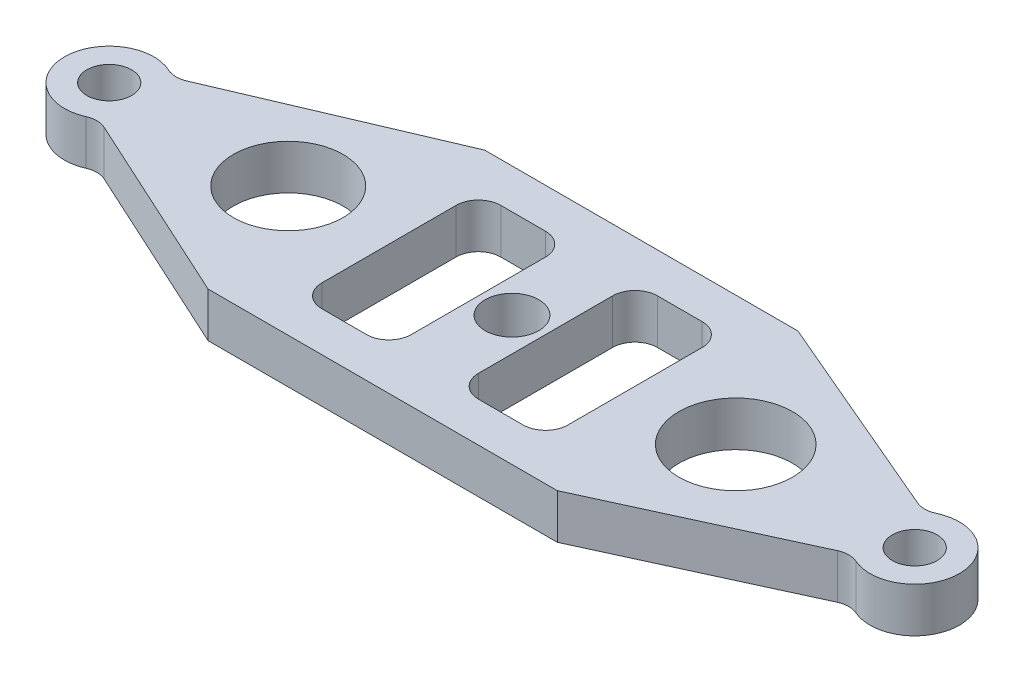
ISO-10303-21;
HEADER;
FILE_DESCRIPTION(('STEP AP214'),'2;1');
FILE_NAME('part.step','',(''),(''),'','','');
FILE_SCHEMA(('AUTOMOTIVE_DESIGN { 1 0 10303 214 1 1 1 1 }'));
ENDSEC;
DATA;
#1=APPLICATION_CONTEXT('core data for automotive mechanical design processes');
#2=APPLICATION_PROTOCOL_DEFINITION('international standard','automotive_design',2000,#1);
#3=PRODUCT_CONTEXT('',#1,'mechanical');
#4=PRODUCT('Part','Part','',(#3));
#5=PRODUCT_RELATED_PRODUCT_CATEGORY('part','',(#4));
#6=PRODUCT_DEFINITION_FORMATION('','',#4);
#7=PRODUCT_DEFINITION_CONTEXT('part definition',#1,'design');
#8=PRODUCT_DEFINITION('design','',#6,#7);
#9=PRODUCT_DEFINITION_SHAPE('','',#8);
#10=(LENGTH_UNIT() NAMED_UNIT(*) SI_UNIT(.MILLI.,.METRE.));
#11=(NAMED_UNIT(*) PLANE_ANGLE_UNIT() SI_UNIT($,.RADIAN.));
#12=(NAMED_UNIT(*) SI_UNIT($,.STERADIAN.) SOLID_ANGLE_UNIT());
#13=UNCERTAINTY_MEASURE_WITH_UNIT(LENGTH_MEASURE(1.E-05),#10,'distance_accuracy_value','');
#14=(GEOMETRIC_REPRESENTATION_CONTEXT(3) GLOBAL_UNCERTAINTY_ASSIGNED_CONTEXT((#13)) GLOBAL_UNIT_ASSIGNED_CONTEXT((#10,
#11,#12)) REPRESENTATION_CONTEXT('',''));
#15=CARTESIAN_POINT('',(0.,0.,0.));
#16=DIRECTION('',(0.,0.,1.));
#17=DIRECTION('',(1.,0.,0.));
#18=AXIS2_PLACEMENT_3D('',#15,#16,#17);
#19=CARTESIAN_POINT('',(83.6387655140134,10.,-13.5843548177414));
#20=DIRECTION('',(0.,-1.,0.));
#21=DIRECTION('',(0.,0.,-1.));
#22=AXIS2_PLACEMENT_3D('',#19,#20,#21);
#23=PLANE('',#22);
#24=CARTESIAN_POINT('',(12.5,10.,15.));
#25=DIRECTION('',(0.,1.,0.));
#26=DIRECTION('',(0.,0.,1.));
#27=AXIS2_PLACEMENT_3D('',#24,#25,#26);
#28=CIRCLE('',#27,5.);
#29=CARTESIAN_POINT('',(7.49999999999999,10.,15.));
#30=VERTEX_POINT('',#29);
#31=CARTESIAN_POINT('',(12.5,10.,20.));
#32=VERTEX_POINT('',#31);
#33=EDGE_CURVE('E286',#30,#32,#28,.T.);
#34=ORIENTED_EDGE('',*,*,#33,.F.);
#35=DIRECTION('',(0.,0.,1.));
#36=VECTOR('',#35,1.);
#37=CARTESIAN_POINT('',(7.49999999999998,10.,-15.));
#38=LINE('',#37,#36);
#39=CARTESIAN_POINT('',(7.49999999999998,10.,-15.));
#40=VERTEX_POINT('',#39);
#41=EDGE_CURVE('E302',#40,#30,#38,.T.);
#42=ORIENTED_EDGE('',*,*,#41,.F.);
#43=CARTESIAN_POINT('',(12.5,10.,-15.));
#44=DIRECTION('',(0.,1.,0.));
#45=DIRECTION('',(0.,0.,-1.));
#46=AXIS2_PLACEMENT_3D('',#43,#44,#45);
#47=CIRCLE('',#46,5.);
#48=CARTESIAN_POINT('',(12.5,10.,-20.));
#49=VERTEX_POINT('',#48);
#50=EDGE_CURVE('E299',#49,#40,#47,.T.);
#51=ORIENTED_EDGE('',*,*,#50,.F.);
#52=DIRECTION('',(-1.,0.,0.));
#53=VECTOR('',#52,1.);
#54=CARTESIAN_POINT('',(12.5,10.,-20.));
#55=LINE('',#54,#53);
#56=CARTESIAN_POINT('',(22.5,10.,-20.));
#57=VERTEX_POINT('',#56);
#58=EDGE_CURVE('E297',#57,#49,#55,.T.);
#59=ORIENTED_EDGE('',*,*,#58,.F.);
#60=CARTESIAN_POINT('',(22.5,10.,-15.));
#61=DIRECTION('',(0.,1.,0.));
#62=DIRECTION('',(0.,0.,1.));
#63=AXIS2_PLACEMENT_3D('',#60,#61,#62);
#64=CIRCLE('',#63,5.);
#65=CARTESIAN_POINT('',(27.5,10.,-15.));
#66=VERTEX_POINT('',#65);
#67=EDGE_CURVE('E295',#66,#57,#64,.T.);
#68=ORIENTED_EDGE('',*,*,#67,.F.);
#69=DIRECTION('',(0.,0.,-1.));
#70=VECTOR('',#69,1.);
#71=CARTESIAN_POINT('',(27.5,10.,-15.));
#72=LINE('',#71,#70);
#73=CARTESIAN_POINT('',(27.5,10.,15.));
#74=VERTEX_POINT('',#73);
#75=EDGE_CURVE('E293',#74,#66,#72,.T.);
#76=ORIENTED_EDGE('',*,*,#75,.F.);
#77=CARTESIAN_POINT('',(22.5,10.,15.));
#78=DIRECTION('',(0.,1.,0.));
#79=DIRECTION('',(0.,0.,1.));
#80=AXIS2_PLACEMENT_3D('',#77,#78,#79);
#81=CIRCLE('',#80,5.);
#82=CARTESIAN_POINT('',(22.5,10.,20.));
#83=VERTEX_POINT('',#82);
#84=EDGE_CURVE('E291',#83,#74,#81,.T.);
#85=ORIENTED_EDGE('',*,*,#84,.F.);
#86=DIRECTION('',(1.,0.,0.));
#87=VECTOR('',#86,1.);
#88=CARTESIAN_POINT('',(12.5,10.,20.));
#89=LINE('',#88,#87);
#90=EDGE_CURVE('E288',#32,#83,#89,.T.);
#91=ORIENTED_EDGE('',*,*,#90,.F.);
#92=EDGE_LOOP('',(#34,#42,#51,#59,#68,#76,#85,#91));
#93=FACE_BOUND('',#92,.T.);
#94=DIRECTION('',(-0.919841385932552,0.,-0.392290485132743));
#95=VECTOR('',#94,1.);
#96=CARTESIAN_POINT('',(35.,10.,-28.8919123326438));
#97=LINE('',#96,#95);
#98=CARTESIAN_POINT('',(81.6773130883497,10.,-8.98514788807868));
#99=VERTEX_POINT('',#98);
#100=CARTESIAN_POINT('',(35.,10.,-28.8919123326438));
#101=VERTEX_POINT('',#100);
#102=EDGE_CURVE('E375',#99,#101,#97,.T.);
#103=ORIENTED_EDGE('',*,*,#102,.T.);
#104=DIRECTION('',(-1.,0.,0.));
#105=VECTOR('',#104,1.);
#106=CARTESIAN_POINT('',(-35.,10.,-28.8919123326438));
#107=LINE('',#106,#105);
#108=CARTESIAN_POINT('',(-35.,10.,-28.8919123326438));
#109=VERTEX_POINT('',#108);
#110=EDGE_CURVE('E378',#101,#109,#107,.T.);
#111=ORIENTED_EDGE('',*,*,#110,.T.);
#112=DIRECTION('',(-0.919841385932552,0.,0.392290485132742));
#113=VECTOR('',#112,1.);
#114=CARTESIAN_POINT('',(-35.,10.,-28.8919123326438));
#115=LINE('',#114,#113);
#116=CARTESIAN_POINT('',(-81.6773130883497,10.,-8.98514788807866));
#117=VERTEX_POINT('',#116);
#118=EDGE_CURVE('E381',#109,#117,#115,.T.);
#119=ORIENTED_EDGE('',*,*,#118,.T.);
#120=CARTESIAN_POINT('',(-83.6387655140134,10.,-13.5843548177414));
#121=DIRECTION('',(0.,-1.,0.));
#122=DIRECTION('',(0.,0.,-1.));
#123=AXIS2_PLACEMENT_3D('',#120,#121,#122);
#124=CIRCLE('',#123,5.);
#125=CARTESIAN_POINT('',(-85.7591770093423,10.,-9.05623654516094));
#126=VERTEX_POINT('',#125);
#127=EDGE_CURVE('E383',#117,#126,#124,.T.);
#128=ORIENTED_EDGE('',*,*,#127,.T.);
#129=CARTESIAN_POINT('',(-90.,10.,0.));
#130=DIRECTION('',(0.,1.,0.));
#131=DIRECTION('',(0.,0.,1.));
#132=AXIS2_PLACEMENT_3D('',#129,#130,#131);
#133=CIRCLE('',#132,10.);
#134=CARTESIAN_POINT('',(-86.0054699959487,10.,9.16753674913463));
#135=VERTEX_POINT('',#134);
#136=EDGE_CURVE('E385',#126,#135,#133,.T.);
#137=ORIENTED_EDGE('',*,*,#136,.T.);
#138=CARTESIAN_POINT('',(-84.008204993923,10.,13.7513051237019));
#139=DIRECTION('',(0.,-1.,0.));
#140=DIRECTION('',(0.,0.,1.));
#141=AXIS2_PLACEMENT_3D('',#138,#139,#140);
#142=CIRCLE('',#141,5.);
#143=CARTESIAN_POINT('',(-81.9231757690581,10.,9.20678610278686));
#144=VERTEX_POINT('',#143);
#145=EDGE_CURVE('E387',#135,#144,#142,.T.);
#146=ORIENTED_EDGE('',*,*,#145,.T.);
#147=DIRECTION('',(0.908903804183016,0.,0.417005844972996));
#148=VECTOR('',#147,1.);
#149=CARTESIAN_POINT('',(-39.0175754475603,10.,28.8919123326438));
#150=LINE('',#149,#148);
#151=CARTESIAN_POINT('',(-39.0175754475603,10.,28.8919123326438));
#152=VERTEX_POINT('',#151);
#153=EDGE_CURVE('E389',#144,#152,#150,.T.);
#154=ORIENTED_EDGE('',*,*,#153,.T.);
#155=DIRECTION('',(1.,0.,0.));
#156=VECTOR('',#155,1.);
#157=CARTESIAN_POINT('',(-39.0175754475603,10.,28.8919123326438));
#158=LINE('',#157,#156);
#159=CARTESIAN_POINT('',(39.0175754475603,10.,28.8919123326438));
#160=VERTEX_POINT('',#159);
#161=EDGE_CURVE('E391',#152,#160,#158,.T.);
#162=ORIENTED_EDGE('',*,*,#161,.T.);
#163=DIRECTION('',(0.908903804183016,0.,-0.417005844972995));
#164=VECTOR('',#163,1.);
#165=CARTESIAN_POINT('',(39.0175754475603,10.,28.8919123326438));
#166=LINE('',#165,#164);
#167=CARTESIAN_POINT('',(81.9231757690581,10.,9.20678610278686));
#168=VERTEX_POINT('',#167);
#169=EDGE_CURVE('E393',#160,#168,#166,.T.);
#170=ORIENTED_EDGE('',*,*,#169,.T.);
#171=CARTESIAN_POINT('',(84.008204993923,10.,13.7513051237019));
#172=DIRECTION('',(0.,-1.,0.));
#173=DIRECTION('',(0.,0.,-1.));
#174=AXIS2_PLACEMENT_3D('',#171,#172,#173);
#175=CIRCLE('',#174,4.99999999999999);
#176=CARTESIAN_POINT('',(86.0054699959487,10.,9.16753674913463));
#177=VERTEX_POINT('',#176);
#178=EDGE_CURVE('E395',#168,#177,#175,.T.);
#179=ORIENTED_EDGE('',*,*,#178,.T.);
#180=CARTESIAN_POINT('',(90.,10.,0.));
#181=DIRECTION('',(0.,1.,0.));
#182=DIRECTION('',(0.,0.,1.));
#183=AXIS2_PLACEMENT_3D('',#180,#181,#182);
#184=CIRCLE('',#183,10.);
#185=CARTESIAN_POINT('',(85.7591770093423,10.,-9.05623654516096));
#186=VERTEX_POINT('',#185);
#187=EDGE_CURVE('E397',#177,#186,#184,.T.);
#188=ORIENTED_EDGE('',*,*,#187,.T.);
#189=CARTESIAN_POINT('',(83.6387655140134,10.,-13.5843548177414));
#190=DIRECTION('',(0.,-1.,0.));
#191=DIRECTION('',(0.,0.,-1.));
#192=AXIS2_PLACEMENT_3D('',#189,#190,#191);
#193=CIRCLE('',#192,5.);
#194=EDGE_CURVE('E399',#186,#99,#193,.T.);
#195=ORIENTED_EDGE('',*,*,#194,.T.);
#196=EDGE_LOOP('',(#103,#111,#119,#128,#137,#146,#154,#162,#170,#179,#188,#195));
#197=FACE_BOUND('',#196,.T.);
#198=CARTESIAN_POINT('',(50.,10.,0.));
#199=DIRECTION('',(0.,1.,0.));
#200=DIRECTION('',(0.,0.,1.));
#201=AXIS2_PLACEMENT_3D('',#198,#199,#200);
#202=CIRCLE('',#201,12.7);
#203=CARTESIAN_POINT('',(50.,10.,12.7));
#204=VERTEX_POINT('',#203);
#205=EDGE_CURVE('E369',#204,#204,#202,.T.);
#206=ORIENTED_EDGE('',*,*,#205,.F.);
#207=EDGE_LOOP('',(#206));
#208=FACE_BOUND('',#207,.T.);
#209=CARTESIAN_POINT('',(-50.,10.,0.));
#210=DIRECTION('',(0.,1.,0.));
#211=DIRECTION('',(0.,0.,1.));
#212=AXIS2_PLACEMENT_3D('',#209,#210,#211);
#213=CIRCLE('',#212,12.25);
#214=CARTESIAN_POINT('',(-50.,10.,12.25));
#215=VERTEX_POINT('',#214);
#216=EDGE_CURVE('E363',#215,#215,#213,.T.);
#217=ORIENTED_EDGE('',*,*,#216,.F.);
#218=EDGE_LOOP('',(#217));
#219=FACE_BOUND('',#218,.T.);
#220=CARTESIAN_POINT('',(-90.,10.,0.));
#221=DIRECTION('',(0.,1.,0.));
#222=DIRECTION('',(0.,0.,1.));
#223=AXIS2_PLACEMENT_3D('',#220,#221,#222);
#224=CIRCLE('',#223,5.);
#225=CARTESIAN_POINT('',(-90.,10.,5.00000000000001));
#226=VERTEX_POINT('',#225);
#227=EDGE_CURVE('E357',#226,#226,#224,.T.);
#228=ORIENTED_EDGE('',*,*,#227,.F.);
#229=EDGE_LOOP('',(#228));
#230=FACE_BOUND('',#229,.T.);
#231=CARTESIAN_POINT('',(90.,10.,0.));
#232=DIRECTION('',(0.,1.,0.));
#233=DIRECTION('',(0.,0.,1.));
#234=AXIS2_PLACEMENT_3D('',#231,#232,#233);
#235=CIRCLE('',#234,5.);
#236=CARTESIAN_POINT('',(90.,10.,5.));
#237=VERTEX_POINT('',#236);
#238=EDGE_CURVE('E351',#237,#237,#235,.T.);
#239=ORIENTED_EDGE('',*,*,#238,.F.);
#240=EDGE_LOOP('',(#239));
#241=FACE_BOUND('',#240,.T.);
#242=CARTESIAN_POINT('',(0.,10.,0.));
#243=DIRECTION('',(0.,1.,0.));
#244=DIRECTION('',(0.,0.,1.));
#245=AXIS2_PLACEMENT_3D('',#242,#243,#244);
#246=CIRCLE('',#245,6.);
#247=CARTESIAN_POINT('',(0.,10.,6.));
#248=VERTEX_POINT('',#247);
#249=EDGE_CURVE('E345',#248,#248,#246,.T.);
#250=ORIENTED_EDGE('',*,*,#249,.F.);
#251=EDGE_LOOP('',(#250));
#252=FACE_BOUND('',#251,.T.);
#253=CARTESIAN_POINT('',(-22.5,10.,15.));
#254=DIRECTION('',(0.,1.,0.));
#255=DIRECTION('',(0.,0.,1.));
#256=AXIS2_PLACEMENT_3D('',#253,#254,#255);
#257=CIRCLE('',#256,5.);
#258=CARTESIAN_POINT('',(-27.5,10.,15.));
#259=VERTEX_POINT('',#258);
#260=CARTESIAN_POINT('',(-22.5,10.,20.));
#261=VERTEX_POINT('',#260);
#262=EDGE_CURVE('E221',#259,#261,#257,.T.);
#263=ORIENTED_EDGE('',*,*,#262,.F.);
#264=DIRECTION('',(0.,0.,1.));
#265=VECTOR('',#264,1.);
#266=CARTESIAN_POINT('',(-27.5,10.,-15.));
#267=LINE('',#266,#265);
#268=CARTESIAN_POINT('',(-27.5,10.,-15.));
#269=VERTEX_POINT('',#268);
#270=EDGE_CURVE('E254',#269,#259,#267,.T.);
#271=ORIENTED_EDGE('',*,*,#270,.F.);
#272=CARTESIAN_POINT('',(-22.5,10.,-15.));
#273=DIRECTION('',(0.,1.,0.));
#274=DIRECTION('',(0.,0.,-1.));
#275=AXIS2_PLACEMENT_3D('',#272,#273,#274);
#276=CIRCLE('',#275,5.);
#277=CARTESIAN_POINT('',(-22.5,10.,-20.));
#278=VERTEX_POINT('',#277);
#279=EDGE_CURVE('E252',#278,#269,#276,.T.);
#280=ORIENTED_EDGE('',*,*,#279,.F.);
#281=DIRECTION('',(-1.,0.,0.));
#282=VECTOR('',#281,1.);
#283=CARTESIAN_POINT('',(-22.5,10.,-20.));
#284=LINE('',#283,#282);
#285=CARTESIAN_POINT('',(-12.5,10.,-20.));
#286=VERTEX_POINT('',#285);
#287=EDGE_CURVE('E250',#286,#278,#284,.T.);
#288=ORIENTED_EDGE('',*,*,#287,.F.);
#289=CARTESIAN_POINT('',(-12.5,10.,-15.));
#290=DIRECTION('',(0.,1.,0.));
#291=DIRECTION('',(0.,0.,1.));
#292=AXIS2_PLACEMENT_3D('',#289,#290,#291);
#293=CIRCLE('',#292,5.);
#294=CARTESIAN_POINT('',(-7.49999999999999,10.,-15.));
#295=VERTEX_POINT('',#294);
#296=EDGE_CURVE('E248',#295,#286,#293,.T.);
#297=ORIENTED_EDGE('',*,*,#296,.F.);
#298=DIRECTION('',(0.,0.,-1.));
#299=VECTOR('',#298,1.);
#300=CARTESIAN_POINT('',(-7.49999999999999,10.,-15.));
#301=LINE('',#300,#299);
#302=CARTESIAN_POINT('',(-7.49999999999998,10.,15.));
#303=VERTEX_POINT('',#302);
#304=EDGE_CURVE('E244',#303,#295,#301,.T.);
#305=ORIENTED_EDGE('',*,*,#304,.F.);
#306=CARTESIAN_POINT('',(-12.5,10.,15.));
#307=DIRECTION('',(0.,1.,0.));
#308=DIRECTION('',(0.,0.,1.));
#309=AXIS2_PLACEMENT_3D('',#306,#307,#308);
#310=CIRCLE('',#309,5.);
#311=CARTESIAN_POINT('',(-12.5,10.,20.));
#312=VERTEX_POINT('',#311);
#313=EDGE_CURVE('E242',#312,#303,#310,.T.);
#314=ORIENTED_EDGE('',*,*,#313,.F.);
#315=DIRECTION('',(1.,0.,0.));
#316=VECTOR('',#315,1.);
#317=CARTESIAN_POINT('',(-22.5,10.,20.));
#318=LINE('',#317,#316);
#319=EDGE_CURVE('E229',#261,#312,#318,.T.);
#320=ORIENTED_EDGE('',*,*,#319,.F.);
#321=EDGE_LOOP('',(#263,#271,#280,#288,#297,#305,#314,#320));
#322=FACE_BOUND('',#321,.T.);
#323=ADVANCED_FACE('F36',(#93,#197,#208,#219,#230,#241,#252,#322),#23,.F.);
#324=CARTESIAN_POINT('',(83.6387655140134,0.,-13.5843548177414));
#325=DIRECTION('',(0.,-1.,0.));
#326=DIRECTION('',(0.,0.,-1.));
#327=AXIS2_PLACEMENT_3D('',#324,#325,#326);
#328=PLANE('',#327);
#329=CARTESIAN_POINT('',(90.,0.,0.));
#330=DIRECTION('',(0.,1.,0.));
#331=DIRECTION('',(0.,0.,1.));
#332=AXIS2_PLACEMENT_3D('',#329,#330,#331);
#333=CIRCLE('',#332,5.);
#334=CARTESIAN_POINT('',(90.,0.,5.));
#335=VERTEX_POINT('',#334);
#336=EDGE_CURVE('E348',#335,#335,#333,.T.);
#337=ORIENTED_EDGE('',*,*,#336,.T.);
#338=EDGE_LOOP('',(#337));
#339=FACE_BOUND('',#338,.T.);
#340=CARTESIAN_POINT('',(-50.,0.,0.));
#341=DIRECTION('',(0.,1.,0.));
#342=DIRECTION('',(0.,0.,1.));
#343=AXIS2_PLACEMENT_3D('',#340,#341,#342);
#344=CIRCLE('',#343,12.25);
#345=CARTESIAN_POINT('',(-50.,0.,12.25));
#346=VERTEX_POINT('',#345);
#347=EDGE_CURVE('E360',#346,#346,#344,.T.);
#348=ORIENTED_EDGE('',*,*,#347,.T.);
#349=EDGE_LOOP('',(#348));
#350=FACE_BOUND('',#349,.T.);
#351=DIRECTION('',(-0.919841385932552,0.,-0.392290485132743));
#352=VECTOR('',#351,1.);
#353=CARTESIAN_POINT('',(35.,0.,-28.8919123326438));
#354=LINE('',#353,#352);
#355=CARTESIAN_POINT('',(81.6773130883497,0.,-8.98514788807868));
#356=VERTEX_POINT('',#355);
#357=CARTESIAN_POINT('',(35.,0.,-28.8919123326438));
#358=VERTEX_POINT('',#357);
#359=EDGE_CURVE('E372',#356,#358,#354,.T.);
#360=ORIENTED_EDGE('',*,*,#359,.F.);
#361=CARTESIAN_POINT('',(83.6387655140134,0.,-13.5843548177414));
#362=DIRECTION('',(0.,-1.,0.));
#363=DIRECTION('',(0.,0.,-1.));
#364=AXIS2_PLACEMENT_3D('',#361,#362,#363);
#365=CIRCLE('',#364,5.);
#366=CARTESIAN_POINT('',(85.7591770093423,0.,-9.05623654516096));
#367=VERTEX_POINT('',#366);
#368=EDGE_CURVE('E379',#367,#356,#365,.T.);
#369=ORIENTED_EDGE('',*,*,#368,.F.);
#370=CARTESIAN_POINT('',(90.,0.,0.));
#371=DIRECTION('',(0.,1.,0.));
#372=DIRECTION('',(0.,0.,1.));
#373=AXIS2_PLACEMENT_3D('',#370,#371,#372);
#374=CIRCLE('',#373,10.);
#375=CARTESIAN_POINT('',(86.0054699959487,0.,9.16753674913463));
#376=VERTEX_POINT('',#375);
#377=EDGE_CURVE('E422',#376,#367,#374,.T.);
#378=ORIENTED_EDGE('',*,*,#377,.F.);
#379=CARTESIAN_POINT('',(84.008204993923,0.,13.7513051237019));
#380=DIRECTION('',(0.,-1.,0.));
#381=DIRECTION('',(0.,0.,-1.));
#382=AXIS2_PLACEMENT_3D('',#379,#380,#381);
#383=CIRCLE('',#382,4.99999999999999);
#384=CARTESIAN_POINT('',(81.9231757690581,0.,9.20678610278686));
#385=VERTEX_POINT('',#384);
#386=EDGE_CURVE('E420',#385,#376,#383,.T.);
#387=ORIENTED_EDGE('',*,*,#386,.F.);
#388=DIRECTION('',(0.908903804183016,0.,-0.417005844972995));
#389=VECTOR('',#388,1.);
#390=CARTESIAN_POINT('',(39.0175754475603,0.,28.8919123326438));
#391=LINE('',#390,#389);
#392=CARTESIAN_POINT('',(39.0175754475603,0.,28.8919123326438));
#393=VERTEX_POINT('',#392);
#394=EDGE_CURVE('E418',#393,#385,#391,.T.);
#395=ORIENTED_EDGE('',*,*,#394,.F.);
#396=DIRECTION('',(1.,0.,0.));
#397=VECTOR('',#396,1.);
#398=CARTESIAN_POINT('',(-39.0175754475603,0.,28.8919123326438));
#399=LINE('',#398,#397);
#400=CARTESIAN_POINT('',(-39.0175754475603,0.,28.8919123326438));
#401=VERTEX_POINT('',#400);
#402=EDGE_CURVE('E416',#401,#393,#399,.T.);
#403=ORIENTED_EDGE('',*,*,#402,.F.);
#404=DIRECTION('',(0.908903804183016,0.,0.417005844972996));
#405=VECTOR('',#404,1.);
#406=CARTESIAN_POINT('',(-39.0175754475603,0.,28.8919123326438));
#407=LINE('',#406,#405);
#408=CARTESIAN_POINT('',(-81.9231757690581,0.,9.20678610278686));
#409=VERTEX_POINT('',#408);
#410=EDGE_CURVE('E414',#409,#401,#407,.T.);
#411=ORIENTED_EDGE('',*,*,#410,.F.);
#412=CARTESIAN_POINT('',(-84.008204993923,0.,13.7513051237019));
#413=DIRECTION('',(0.,-1.,0.));
#414=DIRECTION('',(0.,0.,1.));
#415=AXIS2_PLACEMENT_3D('',#412,#413,#414);
#416=CIRCLE('',#415,5.);
#417=CARTESIAN_POINT('',(-86.0054699959487,0.,9.16753674913463));
#418=VERTEX_POINT('',#417);
#419=EDGE_CURVE('E412',#418,#409,#416,.T.);
#420=ORIENTED_EDGE('',*,*,#419,.F.);
#421=CARTESIAN_POINT('',(-90.,0.,0.));
#422=DIRECTION('',(0.,1.,0.));
#423=DIRECTION('',(0.,0.,1.));
#424=AXIS2_PLACEMENT_3D('',#421,#422,#423);
#425=CIRCLE('',#424,10.);
#426=CARTESIAN_POINT('',(-85.7591770093423,0.,-9.05623654516094));
#427=VERTEX_POINT('',#426);
#428=EDGE_CURVE('E410',#427,#418,#425,.T.);
#429=ORIENTED_EDGE('',*,*,#428,.F.);
#430=CARTESIAN_POINT('',(-83.6387655140134,0.,-13.5843548177414));
#431=DIRECTION('',(0.,-1.,0.));
#432=DIRECTION('',(0.,0.,-1.));
#433=AXIS2_PLACEMENT_3D('',#430,#431,#432);
#434=CIRCLE('',#433,5.);
#435=CARTESIAN_POINT('',(-81.6773130883497,0.,-8.98514788807866));
#436=VERTEX_POINT('',#435);
#437=EDGE_CURVE('E408',#436,#427,#434,.T.);
#438=ORIENTED_EDGE('',*,*,#437,.F.);
#439=DIRECTION('',(-0.919841385932552,0.,0.392290485132742));
#440=VECTOR('',#439,1.);
#441=CARTESIAN_POINT('',(-35.,0.,-28.8919123326438));
#442=LINE('',#441,#440);
#443=CARTESIAN_POINT('',(-35.,0.,-28.8919123326438));
#444=VERTEX_POINT('',#443);
#445=EDGE_CURVE('E406',#444,#436,#442,.T.);
#446=ORIENTED_EDGE('',*,*,#445,.F.);
#447=DIRECTION('',(-1.,0.,0.));
#448=VECTOR('',#447,1.);
#449=CARTESIAN_POINT('',(-35.,0.,-28.8919123326438));
#450=LINE('',#449,#448);
#451=EDGE_CURVE('E404',#358,#444,#450,.T.);
#452=ORIENTED_EDGE('',*,*,#451,.F.);
#453=EDGE_LOOP('',(#360,#369,#378,#387,#395,#403,#411,#420,#429,#438,#446,#452));
#454=FACE_BOUND('',#453,.T.);
#455=CARTESIAN_POINT('',(50.,0.,0.));
#456=DIRECTION('',(0.,1.,0.));
#457=DIRECTION('',(0.,0.,1.));
#458=AXIS2_PLACEMENT_3D('',#455,#456,#457);
#459=CIRCLE('',#458,12.7);
#460=CARTESIAN_POINT('',(50.,0.,12.7));
#461=VERTEX_POINT('',#460);
#462=EDGE_CURVE('E366',#461,#461,#459,.T.);
#463=ORIENTED_EDGE('',*,*,#462,.T.);
#464=EDGE_LOOP('',(#463));
#465=FACE_BOUND('',#464,.T.);
#466=CARTESIAN_POINT('',(-90.,0.,0.));
#467=DIRECTION('',(0.,1.,0.));
#468=DIRECTION('',(0.,0.,1.));
#469=AXIS2_PLACEMENT_3D('',#466,#467,#468);
#470=CIRCLE('',#469,5.);
#471=CARTESIAN_POINT('',(-90.,0.,5.00000000000001));
#472=VERTEX_POINT('',#471);
#473=EDGE_CURVE('E354',#472,#472,#470,.T.);
#474=ORIENTED_EDGE('',*,*,#473,.T.);
#475=EDGE_LOOP('',(#474));
#476=FACE_BOUND('',#475,.T.);
#477=CARTESIAN_POINT('',(0.,0.,0.));
#478=DIRECTION('',(0.,1.,0.));
#479=DIRECTION('',(0.,0.,1.));
#480=AXIS2_PLACEMENT_3D('',#477,#478,#479);
#481=CIRCLE('',#480,6.);
#482=CARTESIAN_POINT('',(0.,0.,6.));
#483=VERTEX_POINT('',#482);
#484=EDGE_CURVE('E344',#483,#483,#481,.T.);
#485=ORIENTED_EDGE('',*,*,#484,.T.);
#486=EDGE_LOOP('',(#485));
#487=FACE_BOUND('',#486,.T.);
#488=DIRECTION('',(0.,0.,1.));
#489=VECTOR('',#488,1.);
#490=CARTESIAN_POINT('',(7.49999999999998,0.,-15.));
#491=LINE('',#490,#489);
#492=CARTESIAN_POINT('',(7.49999999999998,0.,-15.));
#493=VERTEX_POINT('',#492);
#494=CARTESIAN_POINT('',(7.49999999999999,0.,15.));
#495=VERTEX_POINT('',#494);
#496=EDGE_CURVE('E289',#493,#495,#491,.T.);
#497=ORIENTED_EDGE('',*,*,#496,.T.);
#498=CARTESIAN_POINT('',(12.5,0.,15.));
#499=DIRECTION('',(0.,1.,0.));
#500=DIRECTION('',(0.,0.,1.));
#501=AXIS2_PLACEMENT_3D('',#498,#499,#500);
#502=CIRCLE('',#501,5.);
#503=CARTESIAN_POINT('',(12.5,0.,20.));
#504=VERTEX_POINT('',#503);
#505=EDGE_CURVE('E237',#495,#504,#502,.T.);
#506=ORIENTED_EDGE('',*,*,#505,.T.);
#507=DIRECTION('',(1.,0.,0.));
#508=VECTOR('',#507,1.);
#509=CARTESIAN_POINT('',(12.5,0.,20.));
#510=LINE('',#509,#508);
#511=CARTESIAN_POINT('',(22.5,0.,20.));
#512=VERTEX_POINT('',#511);
#513=EDGE_CURVE('E307',#504,#512,#510,.T.);
#514=ORIENTED_EDGE('',*,*,#513,.T.);
#515=CARTESIAN_POINT('',(22.5,0.,15.));
#516=DIRECTION('',(0.,1.,0.));
#517=DIRECTION('',(0.,0.,1.));
#518=AXIS2_PLACEMENT_3D('',#515,#516,#517);
#519=CIRCLE('',#518,5.);
#520=CARTESIAN_POINT('',(27.5,0.,15.));
#521=VERTEX_POINT('',#520);
#522=EDGE_CURVE('E310',#512,#521,#519,.T.);
#523=ORIENTED_EDGE('',*,*,#522,.T.);
#524=DIRECTION('',(0.,0.,-1.));
#525=VECTOR('',#524,1.);
#526=CARTESIAN_POINT('',(27.5,0.,-15.));
#527=LINE('',#526,#525);
#528=CARTESIAN_POINT('',(27.5,0.,-15.));
#529=VERTEX_POINT('',#528);
#530=EDGE_CURVE('E313',#521,#529,#527,.T.);
#531=ORIENTED_EDGE('',*,*,#530,.T.);
#532=CARTESIAN_POINT('',(22.5,0.,-15.));
#533=DIRECTION('',(0.,1.,0.));
#534=DIRECTION('',(0.,0.,1.));
#535=AXIS2_PLACEMENT_3D('',#532,#533,#534);
#536=CIRCLE('',#535,5.);
#537=CARTESIAN_POINT('',(22.5,0.,-20.));
#538=VERTEX_POINT('',#537);
#539=EDGE_CURVE('E316',#529,#538,#536,.T.);
#540=ORIENTED_EDGE('',*,*,#539,.T.);
#541=DIRECTION('',(-1.,0.,0.));
#542=VECTOR('',#541,1.);
#543=CARTESIAN_POINT('',(12.5,0.,-20.));
#544=LINE('',#543,#542);
#545=CARTESIAN_POINT('',(12.5,0.,-20.));
#546=VERTEX_POINT('',#545);
#547=EDGE_CURVE('E319',#538,#546,#544,.T.);
#548=ORIENTED_EDGE('',*,*,#547,.T.);
#549=CARTESIAN_POINT('',(12.5,0.,-15.));
#550=DIRECTION('',(0.,1.,0.));
#551=DIRECTION('',(0.,0.,-1.));
#552=AXIS2_PLACEMENT_3D('',#549,#550,#551);
#553=CIRCLE('',#552,5.);
#554=EDGE_CURVE('E322',#546,#493,#553,.T.);
#555=ORIENTED_EDGE('',*,*,#554,.T.);
#556=EDGE_LOOP('',(#497,#506,#514,#523,#531,#540,#548,#555));
#557=FACE_BOUND('',#556,.T.);
#558=DIRECTION('',(0.,0.,1.));
#559=VECTOR('',#558,1.);
#560=CARTESIAN_POINT('',(-27.5,0.,-15.));
#561=LINE('',#560,#559);
#562=CARTESIAN_POINT('',(-27.5,0.,-15.));
#563=VERTEX_POINT('',#562);
#564=CARTESIAN_POINT('',(-27.5,0.,15.));
#565=VERTEX_POINT('',#564);
#566=EDGE_CURVE('E230',#563,#565,#561,.T.);
#567=ORIENTED_EDGE('',*,*,#566,.T.);
#568=CARTESIAN_POINT('',(-22.5,0.,15.));
#569=DIRECTION('',(0.,1.,0.));
#570=DIRECTION('',(0.,0.,1.));
#571=AXIS2_PLACEMENT_3D('',#568,#569,#570);
#572=CIRCLE('',#571,5.);
#573=CARTESIAN_POINT('',(-22.5,0.,20.));
#574=VERTEX_POINT('',#573);
#575=EDGE_CURVE('E59',#565,#574,#572,.T.);
#576=ORIENTED_EDGE('',*,*,#575,.T.);
#577=DIRECTION('',(1.,0.,0.));
#578=VECTOR('',#577,1.);
#579=CARTESIAN_POINT('',(-22.5,0.,20.));
#580=LINE('',#579,#578);
#581=CARTESIAN_POINT('',(-12.5,0.,20.));
#582=VERTEX_POINT('',#581);
#583=EDGE_CURVE('E236',#574,#582,#580,.T.);
#584=ORIENTED_EDGE('',*,*,#583,.T.);
#585=CARTESIAN_POINT('',(-12.5,0.,15.));
#586=DIRECTION('',(0.,1.,0.));
#587=DIRECTION('',(0.,0.,1.));
#588=AXIS2_PLACEMENT_3D('',#585,#586,#587);
#589=CIRCLE('',#588,5.);
#590=CARTESIAN_POINT('',(-7.49999999999998,0.,15.));
#591=VERTEX_POINT('',#590);
#592=EDGE_CURVE('E258',#582,#591,#589,.T.);
#593=ORIENTED_EDGE('',*,*,#592,.T.);
#594=DIRECTION('',(0.,0.,-1.));
#595=VECTOR('',#594,1.);
#596=CARTESIAN_POINT('',(-7.49999999999999,0.,-15.));
#597=LINE('',#596,#595);
#598=CARTESIAN_POINT('',(-7.49999999999999,0.,-15.));
#599=VERTEX_POINT('',#598);
#600=EDGE_CURVE('E261',#591,#599,#597,.T.);
#601=ORIENTED_EDGE('',*,*,#600,.T.);
#602=CARTESIAN_POINT('',(-12.5,0.,-15.));
#603=DIRECTION('',(0.,1.,0.));
#604=DIRECTION('',(0.,0.,1.));
#605=AXIS2_PLACEMENT_3D('',#602,#603,#604);
#606=CIRCLE('',#605,5.);
#607=CARTESIAN_POINT('',(-12.5,0.,-20.));
#608=VERTEX_POINT('',#607);
#609=EDGE_CURVE('E264',#599,#608,#606,.T.);
#610=ORIENTED_EDGE('',*,*,#609,.T.);
#611=DIRECTION('',(-1.,0.,0.));
#612=VECTOR('',#611,1.);
#613=CARTESIAN_POINT('',(-22.5,0.,-20.));
#614=LINE('',#613,#612);
#615=CARTESIAN_POINT('',(-22.5,0.,-20.));
#616=VERTEX_POINT('',#615);
#617=EDGE_CURVE('E267',#608,#616,#614,.T.);
#618=ORIENTED_EDGE('',*,*,#617,.T.);
#619=CARTESIAN_POINT('',(-22.5,0.,-15.));
#620=DIRECTION('',(0.,1.,0.));
#621=DIRECTION('',(0.,0.,-1.));
#622=AXIS2_PLACEMENT_3D('',#619,#620,#621);
#623=CIRCLE('',#622,5.);
#624=EDGE_CURVE('E270',#616,#563,#623,.T.);
#625=ORIENTED_EDGE('',*,*,#624,.T.);
#626=EDGE_LOOP('',(#567,#576,#584,#593,#601,#610,#618,#625));
#627=FACE_BOUND('',#626,.T.);
#628=ADVANCED_FACE('F464',(#339,#350,#454,#465,#476,#487,#557,#627),#328,.T.);
#629=CARTESIAN_POINT('',(35.,10.,-28.8919123326438));
#630=DIRECTION('',(-0.392290485132743,0.,0.919841385932552));
#631=DIRECTION('',(0.919841385932552,0.,0.392290485132743));
#632=AXIS2_PLACEMENT_3D('',#629,#630,#631);
#633=PLANE('',#632);
#634=ORIENTED_EDGE('',*,*,#359,.T.);
#635=DIRECTION('',(0.,-1.,0.));
#636=VECTOR('',#635,1.);
#637=CARTESIAN_POINT('',(35.,10.,-28.8919123326438));
#638=LINE('',#637,#636);
#639=EDGE_CURVE('E11',#101,#358,#638,.T.);
#640=ORIENTED_EDGE('',*,*,#639,.F.);
#641=ORIENTED_EDGE('',*,*,#102,.F.);
#642=DIRECTION('',(0.,-1.,0.));
#643=VECTOR('',#642,1.);
#644=CARTESIAN_POINT('',(81.6773130883497,10.,-8.98514788807868));
#645=LINE('',#644,#643);
#646=EDGE_CURVE('E401',#99,#356,#645,.T.);
#647=ORIENTED_EDGE('',*,*,#646,.T.);
#648=EDGE_LOOP('',(#634,#640,#641,#647));
#649=FACE_BOUND('',#648,.T.);
#650=ADVANCED_FACE('F38',(#649),#633,.F.);
#651=CARTESIAN_POINT('',(-35.,10.,-28.8919123326438));
#652=DIRECTION('',(0.,0.,1.));
#653=DIRECTION('',(1.,0.,0.));
#654=AXIS2_PLACEMENT_3D('',#651,#652,#653);
#655=PLANE('',#654);
#656=ORIENTED_EDGE('',*,*,#451,.T.);
#657=DIRECTION('',(0.,-1.,0.));
#658=VECTOR('',#657,1.);
#659=CARTESIAN_POINT('',(-35.,10.,-28.8919123326438));
#660=LINE('',#659,#658);
#661=EDGE_CURVE('E44',#109,#444,#660,.T.);
#662=ORIENTED_EDGE('',*,*,#661,.F.);
#663=ORIENTED_EDGE('',*,*,#110,.F.);
#664=ORIENTED_EDGE('',*,*,#639,.T.);
#665=EDGE_LOOP('',(#656,#662,#663,#664));
#666=FACE_BOUND('',#665,.T.);
#667=ADVANCED_FACE('F482',(#666),#655,.F.);
#668=CARTESIAN_POINT('',(-35.,10.,-28.8919123326438));
#669=DIRECTION('',(0.392290485132743,0.,0.919841385932552));
#670=DIRECTION('',(0.919841385932552,0.,-0.392290485132743));
#671=AXIS2_PLACEMENT_3D('',#668,#669,#670);
#672=PLANE('',#671);
#673=ORIENTED_EDGE('',*,*,#445,.T.);
#674=DIRECTION('',(0.,-1.,0.));
#675=VECTOR('',#674,1.);
#676=CARTESIAN_POINT('',(-81.6773130883497,10.,-8.98514788807866));
#677=LINE('',#676,#675);
#678=EDGE_CURVE('E451',#117,#436,#677,.T.);
#679=ORIENTED_EDGE('',*,*,#678,.F.);
#680=ORIENTED_EDGE('',*,*,#118,.F.);
#681=ORIENTED_EDGE('',*,*,#661,.T.);
#682=EDGE_LOOP('',(#673,#679,#680,#681));
#683=FACE_BOUND('',#682,.T.);
#684=ADVANCED_FACE('F458',(#683),#672,.F.);
#685=CARTESIAN_POINT('',(-83.6387655140134,10.,-13.5843548177414));
#686=DIRECTION('',(0.,-1.,0.));
#687=DIRECTION('',(0.,0.,-1.));
#688=AXIS2_PLACEMENT_3D('',#685,#686,#687);
#689=CYLINDRICAL_SURFACE('',#688,5.);
#690=ORIENTED_EDGE('',*,*,#437,.T.);
#691=DIRECTION('',(0.,-1.,0.));
#692=VECTOR('',#691,1.);
#693=CARTESIAN_POINT('',(-85.7591770093423,10.,-9.05623654516094));
#694=LINE('',#693,#692);
#695=EDGE_CURVE('E448',#126,#427,#694,.T.);
#696=ORIENTED_EDGE('',*,*,#695,.F.);
#697=ORIENTED_EDGE('',*,*,#127,.F.);
#698=ORIENTED_EDGE('',*,*,#678,.T.);
#699=EDGE_LOOP('',(#690,#696,#697,#698));
#700=FACE_BOUND('',#699,.T.);
#701=ADVANCED_FACE('F470',(#700),#689,.F.);
#702=CARTESIAN_POINT('',(-90.,10.,0.));
#703=DIRECTION('',(0.,-1.,0.));
#704=DIRECTION('',(0.,0.,-1.));
#705=AXIS2_PLACEMENT_3D('',#702,#703,#704);
#706=CYLINDRICAL_SURFACE('',#705,10.);
#707=ORIENTED_EDGE('',*,*,#428,.T.);
#708=DIRECTION('',(0.,-1.,0.));
#709=VECTOR('',#708,1.);
#710=CARTESIAN_POINT('',(-86.0054699959487,10.,9.16753674913463));
#711=LINE('',#710,#709);
#712=EDGE_CURVE('E445',#135,#418,#711,.T.);
#713=ORIENTED_EDGE('',*,*,#712,.F.);
#714=ORIENTED_EDGE('',*,*,#136,.F.);
#715=ORIENTED_EDGE('',*,*,#695,.T.);
#716=EDGE_LOOP('',(#707,#713,#714,#715));
#717=FACE_BOUND('',#716,.T.);
#718=ADVANCED_FACE('F474',(#717),#706,.T.);
#719=CARTESIAN_POINT('',(-84.008204993923,10.,13.7513051237019));
#720=DIRECTION('',(0.,-1.,0.));
#721=DIRECTION('',(0.,0.,-1.));
#722=AXIS2_PLACEMENT_3D('',#719,#720,#721);
#723=CYLINDRICAL_SURFACE('',#722,5.);
#724=ORIENTED_EDGE('',*,*,#419,.T.);
#725=DIRECTION('',(0.,-1.,0.));
#726=VECTOR('',#725,1.);
#727=CARTESIAN_POINT('',(-81.9231757690581,10.,9.20678610278686));
#728=LINE('',#727,#726);
#729=EDGE_CURVE('E442',#144,#409,#728,.T.);
#730=ORIENTED_EDGE('',*,*,#729,.F.);
#731=ORIENTED_EDGE('',*,*,#145,.F.);
#732=ORIENTED_EDGE('',*,*,#712,.T.);
#733=EDGE_LOOP('',(#724,#730,#731,#732));
#734=FACE_BOUND('',#733,.T.);
#735=ADVANCED_FACE('F515',(#734),#723,.F.);
#736=CARTESIAN_POINT('',(-39.0175754475603,10.,28.8919123326438));
#737=DIRECTION('',(0.417005844972996,0.,-0.908903804183016));
#738=DIRECTION('',(-0.908903804183016,0.,-0.417005844972996));
#739=AXIS2_PLACEMENT_3D('',#736,#737,#738);
#740=PLANE('',#739);
#741=ORIENTED_EDGE('',*,*,#410,.T.);
#742=DIRECTION('',(0.,-1.,0.));
#743=VECTOR('',#742,1.);
#744=CARTESIAN_POINT('',(-39.0175754475603,10.,28.8919123326438));
#745=LINE('',#744,#743);
#746=EDGE_CURVE('E439',#152,#401,#745,.T.);
#747=ORIENTED_EDGE('',*,*,#746,.F.);
#748=ORIENTED_EDGE('',*,*,#153,.F.);
#749=ORIENTED_EDGE('',*,*,#729,.T.);
#750=EDGE_LOOP('',(#741,#747,#748,#749));
#751=FACE_BOUND('',#750,.T.);
#752=ADVANCED_FACE('F513',(#751),#740,.F.);
#753=CARTESIAN_POINT('',(-39.0175754475603,10.,28.8919123326438));
#754=DIRECTION('',(0.,0.,-1.));
#755=DIRECTION('',(-1.,0.,0.));
#756=AXIS2_PLACEMENT_3D('',#753,#754,#755);
#757=PLANE('',#756);
#758=ORIENTED_EDGE('',*,*,#402,.T.);
#759=DIRECTION('',(0.,-1.,0.));
#760=VECTOR('',#759,1.);
#761=CARTESIAN_POINT('',(39.0175754475603,10.,28.8919123326438));
#762=LINE('',#761,#760);
#763=EDGE_CURVE('E436',#160,#393,#762,.T.);
#764=ORIENTED_EDGE('',*,*,#763,.F.);
#765=ORIENTED_EDGE('',*,*,#161,.F.);
#766=ORIENTED_EDGE('',*,*,#746,.T.);
#767=EDGE_LOOP('',(#758,#764,#765,#766));
#768=FACE_BOUND('',#767,.T.);
#769=ADVANCED_FACE('F509',(#768),#757,.F.);
#770=CARTESIAN_POINT('',(39.0175754475603,10.,28.8919123326438));
#771=DIRECTION('',(-0.417005844972995,0.,-0.908903804183016));
#772=DIRECTION('',(-0.908903804183016,0.,0.417005844972995));
#773=AXIS2_PLACEMENT_3D('',#770,#771,#772);
#774=PLANE('',#773);
#775=ORIENTED_EDGE('',*,*,#394,.T.);
#776=DIRECTION('',(0.,-1.,0.));
#777=VECTOR('',#776,1.);
#778=CARTESIAN_POINT('',(81.9231757690581,10.,9.20678610278686));
#779=LINE('',#778,#777);
#780=EDGE_CURVE('E433',#168,#385,#779,.T.);
#781=ORIENTED_EDGE('',*,*,#780,.F.);
#782=ORIENTED_EDGE('',*,*,#169,.F.);
#783=ORIENTED_EDGE('',*,*,#763,.T.);
#784=EDGE_LOOP('',(#775,#781,#782,#783));
#785=FACE_BOUND('',#784,.T.);
#786=ADVANCED_FACE('F504',(#785),#774,.F.);
#787=CARTESIAN_POINT('',(84.008204993923,10.,13.7513051237019));
#788=DIRECTION('',(0.,-1.,0.));
#789=DIRECTION('',(0.,0.,-1.));
#790=AXIS2_PLACEMENT_3D('',#787,#788,#789);
#791=CYLINDRICAL_SURFACE('',#790,4.99999999999999);
#792=ORIENTED_EDGE('',*,*,#386,.T.);
#793=DIRECTION('',(0.,-1.,0.));
#794=VECTOR('',#793,1.);
#795=CARTESIAN_POINT('',(86.0054699959487,10.,9.16753674913463));
#796=LINE('',#795,#794);
#797=EDGE_CURVE('E430',#177,#376,#796,.T.);
#798=ORIENTED_EDGE('',*,*,#797,.F.);
#799=ORIENTED_EDGE('',*,*,#178,.F.);
#800=ORIENTED_EDGE('',*,*,#780,.T.);
#801=EDGE_LOOP('',(#792,#798,#799,#800));
#802=FACE_BOUND('',#801,.T.);
#803=ADVANCED_FACE('F498',(#802),#791,.F.);
#804=CARTESIAN_POINT('',(90.,10.,0.));
#805=DIRECTION('',(0.,-1.,0.));
#806=DIRECTION('',(0.,0.,-1.));
#807=AXIS2_PLACEMENT_3D('',#804,#805,#806);
#808=CYLINDRICAL_SURFACE('',#807,10.);
#809=ORIENTED_EDGE('',*,*,#377,.T.);
#810=DIRECTION('',(0.,-1.,0.));
#811=VECTOR('',#810,1.);
#812=CARTESIAN_POINT('',(85.7591770093423,10.,-9.05623654516096));
#813=LINE('',#812,#811);
#814=EDGE_CURVE('E427',#186,#367,#813,.T.);
#815=ORIENTED_EDGE('',*,*,#814,.F.);
#816=ORIENTED_EDGE('',*,*,#187,.F.);
#817=ORIENTED_EDGE('',*,*,#797,.T.);
#818=EDGE_LOOP('',(#809,#815,#816,#817));
#819=FACE_BOUND('',#818,.T.);
#820=ADVANCED_FACE('F494',(#819),#808,.T.);
#821=CARTESIAN_POINT('',(83.6387655140134,10.,-13.5843548177414));
#822=DIRECTION('',(0.,-1.,0.));
#823=DIRECTION('',(0.,0.,-1.));
#824=AXIS2_PLACEMENT_3D('',#821,#822,#823);
#825=CYLINDRICAL_SURFACE('',#824,5.);
#826=ORIENTED_EDGE('',*,*,#368,.T.);
#827=ORIENTED_EDGE('',*,*,#646,.F.);
#828=ORIENTED_EDGE('',*,*,#194,.F.);
#829=ORIENTED_EDGE('',*,*,#814,.T.);
#830=EDGE_LOOP('',(#826,#827,#828,#829));
#831=FACE_BOUND('',#830,.T.);
#832=ADVANCED_FACE('F489',(#831),#825,.F.);
#833=CARTESIAN_POINT('',(50.,10.,0.));
#834=DIRECTION('',(0.,-1.,0.));
#835=DIRECTION('',(0.,0.,-1.));
#836=AXIS2_PLACEMENT_3D('',#833,#834,#835);
#837=CYLINDRICAL_SURFACE('',#836,12.7);
#838=ORIENTED_EDGE('',*,*,#205,.T.);
#839=EDGE_LOOP('',(#838));
#840=FACE_BOUND('',#839,.T.);
#841=ORIENTED_EDGE('',*,*,#462,.F.);
#842=EDGE_LOOP('',(#841));
#843=FACE_BOUND('',#842,.T.);
#844=ADVANCED_FACE('F534',(#840,#843),#837,.F.);
#845=CARTESIAN_POINT('',(-50.,10.,0.));
#846=DIRECTION('',(0.,-1.,0.));
#847=DIRECTION('',(0.,0.,-1.));
#848=AXIS2_PLACEMENT_3D('',#845,#846,#847);
#849=CYLINDRICAL_SURFACE('',#848,12.25);
#850=ORIENTED_EDGE('',*,*,#216,.T.);
#851=EDGE_LOOP('',(#850));
#852=FACE_BOUND('',#851,.T.);
#853=ORIENTED_EDGE('',*,*,#347,.F.);
#854=EDGE_LOOP('',(#853));
#855=FACE_BOUND('',#854,.T.);
#856=ADVANCED_FACE('F572',(#852,#855),#849,.F.);
#857=CARTESIAN_POINT('',(-90.,10.,0.));
#858=DIRECTION('',(0.,-1.,0.));
#859=DIRECTION('',(0.,0.,-1.));
#860=AXIS2_PLACEMENT_3D('',#857,#858,#859);
#861=CYLINDRICAL_SURFACE('',#860,5.);
#862=ORIENTED_EDGE('',*,*,#227,.T.);
#863=EDGE_LOOP('',(#862));
#864=FACE_BOUND('',#863,.T.);
#865=ORIENTED_EDGE('',*,*,#473,.F.);
#866=EDGE_LOOP('',(#865));
#867=FACE_BOUND('',#866,.T.);
#868=ADVANCED_FACE('F579',(#864,#867),#861,.F.);
#869=CARTESIAN_POINT('',(90.,10.,0.));
#870=DIRECTION('',(0.,-1.,0.));
#871=DIRECTION('',(0.,0.,-1.));
#872=AXIS2_PLACEMENT_3D('',#869,#870,#871);
#873=CYLINDRICAL_SURFACE('',#872,5.);
#874=ORIENTED_EDGE('',*,*,#238,.T.);
#875=EDGE_LOOP('',(#874));
#876=FACE_BOUND('',#875,.T.);
#877=ORIENTED_EDGE('',*,*,#336,.F.);
#878=EDGE_LOOP('',(#877));
#879=FACE_BOUND('',#878,.T.);
#880=ADVANCED_FACE('F586',(#876,#879),#873,.F.);
#881=CARTESIAN_POINT('',(0.,10.,0.));
#882=DIRECTION('',(0.,-1.,0.));
#883=DIRECTION('',(0.,0.,-1.));
#884=AXIS2_PLACEMENT_3D('',#881,#882,#883);
#885=CYLINDRICAL_SURFACE('',#884,6.);
#886=ORIENTED_EDGE('',*,*,#249,.T.);
#887=EDGE_LOOP('',(#886));
#888=FACE_BOUND('',#887,.T.);
#889=ORIENTED_EDGE('',*,*,#484,.F.);
#890=EDGE_LOOP('',(#889));
#891=FACE_BOUND('',#890,.T.);
#892=ADVANCED_FACE('F594',(#888,#891),#885,.F.);
#893=CARTESIAN_POINT('',(12.5,10.,15.));
#894=DIRECTION('',(0.,-1.,0.));
#895=DIRECTION('',(0.,0.,-1.));
#896=AXIS2_PLACEMENT_3D('',#893,#894,#895);
#897=CYLINDRICAL_SURFACE('',#896,5.);
#898=ORIENTED_EDGE('',*,*,#505,.F.);
#899=DIRECTION('',(0.,-1.,0.));
#900=VECTOR('',#899,1.);
#901=CARTESIAN_POINT('',(7.49999999999999,10.,15.));
#902=LINE('',#901,#900);
#903=EDGE_CURVE('E304',#30,#495,#902,.T.);
#904=ORIENTED_EDGE('',*,*,#903,.F.);
#905=ORIENTED_EDGE('',*,*,#33,.T.);
#906=DIRECTION('',(0.,-1.,0.));
#907=VECTOR('',#906,1.);
#908=CARTESIAN_POINT('',(12.5,10.,20.));
#909=LINE('',#908,#907);
#910=EDGE_CURVE('E341',#32,#504,#909,.T.);
#911=ORIENTED_EDGE('',*,*,#910,.T.);
#912=EDGE_LOOP('',(#898,#904,#905,#911));
#913=FACE_BOUND('',#912,.T.);
#914=ADVANCED_FACE('F602',(#913),#897,.F.);
#915=CARTESIAN_POINT('',(12.5,10.,20.));
#916=DIRECTION('',(0.,0.,-1.));
#917=DIRECTION('',(-1.,0.,0.));
#918=AXIS2_PLACEMENT_3D('',#915,#916,#917);
#919=PLANE('',#918);
#920=ORIENTED_EDGE('',*,*,#513,.F.);
#921=ORIENTED_EDGE('',*,*,#910,.F.);
#922=ORIENTED_EDGE('',*,*,#90,.T.);
#923=DIRECTION('',(0.,-1.,0.));
#924=VECTOR('',#923,1.);
#925=CARTESIAN_POINT('',(22.5,10.,20.));
#926=LINE('',#925,#924);
#927=EDGE_CURVE('E339',#83,#512,#926,.T.);
#928=ORIENTED_EDGE('',*,*,#927,.T.);
#929=EDGE_LOOP('',(#920,#921,#922,#928));
#930=FACE_BOUND('',#929,.T.);
#931=ADVANCED_FACE('F610',(#930),#919,.T.);
#932=CARTESIAN_POINT('',(22.5,10.,15.));
#933=DIRECTION('',(0.,-1.,0.));
#934=DIRECTION('',(0.,0.,-1.));
#935=AXIS2_PLACEMENT_3D('',#932,#933,#934);
#936=CYLINDRICAL_SURFACE('',#935,5.);
#937=ORIENTED_EDGE('',*,*,#522,.F.);
#938=ORIENTED_EDGE('',*,*,#927,.F.);
#939=ORIENTED_EDGE('',*,*,#84,.T.);
#940=DIRECTION('',(0.,-1.,0.));
#941=VECTOR('',#940,1.);
#942=CARTESIAN_POINT('',(27.5,10.,15.));
#943=LINE('',#942,#941);
#944=EDGE_CURVE('E337',#74,#521,#943,.T.);
#945=ORIENTED_EDGE('',*,*,#944,.T.);
#946=EDGE_LOOP('',(#937,#938,#939,#945));
#947=FACE_BOUND('',#946,.T.);
#948=ADVANCED_FACE('F618',(#947),#936,.F.);
#949=CARTESIAN_POINT('',(27.5,10.,-15.));
#950=DIRECTION('',(-1.,0.,0.));
#951=DIRECTION('',(0.,0.,1.));
#952=AXIS2_PLACEMENT_3D('',#949,#950,#951);
#953=PLANE('',#952);
#954=ORIENTED_EDGE('',*,*,#530,.F.);
#955=ORIENTED_EDGE('',*,*,#944,.F.);
#956=ORIENTED_EDGE('',*,*,#75,.T.);
#957=DIRECTION('',(0.,-1.,0.));
#958=VECTOR('',#957,1.);
#959=CARTESIAN_POINT('',(27.5,10.,-15.));
#960=LINE('',#959,#958);
#961=EDGE_CURVE('E335',#66,#529,#960,.T.);
#962=ORIENTED_EDGE('',*,*,#961,.T.);
#963=EDGE_LOOP('',(#954,#955,#956,#962));
#964=FACE_BOUND('',#963,.T.);
#965=ADVANCED_FACE('F626',(#964),#953,.T.);
#966=CARTESIAN_POINT('',(22.5,10.,-15.));
#967=DIRECTION('',(0.,-1.,0.));
#968=DIRECTION('',(0.,0.,-1.));
#969=AXIS2_PLACEMENT_3D('',#966,#967,#968);
#970=CYLINDRICAL_SURFACE('',#969,5.);
#971=ORIENTED_EDGE('',*,*,#539,.F.);
#972=ORIENTED_EDGE('',*,*,#961,.F.);
#973=ORIENTED_EDGE('',*,*,#67,.T.);
#974=DIRECTION('',(0.,-1.,0.));
#975=VECTOR('',#974,1.);
#976=CARTESIAN_POINT('',(22.5,10.,-20.));
#977=LINE('',#976,#975);
#978=EDGE_CURVE('E333',#57,#538,#977,.T.);
#979=ORIENTED_EDGE('',*,*,#978,.T.);
#980=EDGE_LOOP('',(#971,#972,#973,#979));
#981=FACE_BOUND('',#980,.T.);
#982=ADVANCED_FACE('F634',(#981),#970,.F.);
#983=CARTESIAN_POINT('',(12.5,10.,-20.));
#984=DIRECTION('',(0.,0.,1.));
#985=DIRECTION('',(1.,0.,0.));
#986=AXIS2_PLACEMENT_3D('',#983,#984,#985);
#987=PLANE('',#986);
#988=ORIENTED_EDGE('',*,*,#547,.F.);
#989=ORIENTED_EDGE('',*,*,#978,.F.);
#990=ORIENTED_EDGE('',*,*,#58,.T.);
#991=DIRECTION('',(0.,-1.,0.));
#992=VECTOR('',#991,1.);
#993=CARTESIAN_POINT('',(12.5,10.,-20.));
#994=LINE('',#993,#992);
#995=EDGE_CURVE('E331',#49,#546,#994,.T.);
#996=ORIENTED_EDGE('',*,*,#995,.T.);
#997=EDGE_LOOP('',(#988,#989,#990,#996));
#998=FACE_BOUND('',#997,.T.);
#999=ADVANCED_FACE('F642',(#998),#987,.T.);
#1000=CARTESIAN_POINT('',(12.5,10.,-15.));
#1001=DIRECTION('',(0.,-1.,0.));
#1002=DIRECTION('',(0.,0.,-1.));
#1003=AXIS2_PLACEMENT_3D('',#1000,#1001,#1002);
#1004=CYLINDRICAL_SURFACE('',#1003,5.);
#1005=ORIENTED_EDGE('',*,*,#554,.F.);
#1006=ORIENTED_EDGE('',*,*,#995,.F.);
#1007=ORIENTED_EDGE('',*,*,#50,.T.);
#1008=DIRECTION('',(0.,-1.,0.));
#1009=VECTOR('',#1008,1.);
#1010=CARTESIAN_POINT('',(7.49999999999998,10.,-15.));
#1011=LINE('',#1010,#1009);
#1012=EDGE_CURVE('E329',#40,#493,#1011,.T.);
#1013=ORIENTED_EDGE('',*,*,#1012,.T.);
#1014=EDGE_LOOP('',(#1005,#1006,#1007,#1013));
#1015=FACE_BOUND('',#1014,.T.);
#1016=ADVANCED_FACE('F650',(#1015),#1004,.F.);
#1017=CARTESIAN_POINT('',(7.49999999999998,10.,-15.));
#1018=DIRECTION('',(1.,0.,0.));
#1019=DIRECTION('',(0.,0.,-1.));
#1020=AXIS2_PLACEMENT_3D('',#1017,#1018,#1019);
#1021=PLANE('',#1020);
#1022=ORIENTED_EDGE('',*,*,#496,.F.);
#1023=ORIENTED_EDGE('',*,*,#1012,.F.);
#1024=ORIENTED_EDGE('',*,*,#41,.T.);
#1025=ORIENTED_EDGE('',*,*,#903,.T.);
#1026=EDGE_LOOP('',(#1022,#1023,#1024,#1025));
#1027=FACE_BOUND('',#1026,.T.);
#1028=ADVANCED_FACE('F658',(#1027),#1021,.T.);
#1029=CARTESIAN_POINT('',(-22.5,10.,15.));
#1030=DIRECTION('',(0.,-1.,0.));
#1031=DIRECTION('',(0.,0.,-1.));
#1032=AXIS2_PLACEMENT_3D('',#1029,#1030,#1031);
#1033=CYLINDRICAL_SURFACE('',#1032,5.);
#1034=ORIENTED_EDGE('',*,*,#575,.F.);
#1035=DIRECTION('',(0.,-1.,0.));
#1036=VECTOR('',#1035,1.);
#1037=CARTESIAN_POINT('',(-27.5,10.,15.));
#1038=LINE('',#1037,#1036);
#1039=EDGE_CURVE('E225',#259,#565,#1038,.T.);
#1040=ORIENTED_EDGE('',*,*,#1039,.F.);
#1041=ORIENTED_EDGE('',*,*,#262,.T.);
#1042=DIRECTION('',(0.,-1.,0.));
#1043=VECTOR('',#1042,1.);
#1044=CARTESIAN_POINT('',(-22.5,10.,20.));
#1045=LINE('',#1044,#1043);
#1046=EDGE_CURVE('E224',#261,#574,#1045,.T.);
#1047=ORIENTED_EDGE('',*,*,#1046,.T.);
#1048=EDGE_LOOP('',(#1034,#1040,#1041,#1047));
#1049=FACE_BOUND('',#1048,.T.);
#1050=ADVANCED_FACE('F223',(#1049),#1033,.F.);
#1051=CARTESIAN_POINT('',(-22.5,10.,20.));
#1052=DIRECTION('',(0.,0.,-1.));
#1053=DIRECTION('',(-1.,0.,0.));
#1054=AXIS2_PLACEMENT_3D('',#1051,#1052,#1053);
#1055=PLANE('',#1054);
#1056=ORIENTED_EDGE('',*,*,#583,.F.);
#1057=ORIENTED_EDGE('',*,*,#1046,.F.);
#1058=ORIENTED_EDGE('',*,*,#319,.T.);
#1059=DIRECTION('',(0.,-1.,0.));
#1060=VECTOR('',#1059,1.);
#1061=CARTESIAN_POINT('',(-12.5,10.,20.));
#1062=LINE('',#1061,#1060);
#1063=EDGE_CURVE('E238',#312,#582,#1062,.T.);
#1064=ORIENTED_EDGE('',*,*,#1063,.T.);
#1065=EDGE_LOOP('',(#1056,#1057,#1058,#1064));
#1066=FACE_BOUND('',#1065,.T.);
#1067=ADVANCED_FACE('F233',(#1066),#1055,.T.);
#1068=CARTESIAN_POINT('',(-12.5,10.,15.));
#1069=DIRECTION('',(0.,-1.,0.));
#1070=DIRECTION('',(0.,0.,-1.));
#1071=AXIS2_PLACEMENT_3D('',#1068,#1069,#1070);
#1072=CYLINDRICAL_SURFACE('',#1071,5.);
#1073=ORIENTED_EDGE('',*,*,#592,.F.);
#1074=ORIENTED_EDGE('',*,*,#1063,.F.);
#1075=ORIENTED_EDGE('',*,*,#313,.T.);
#1076=DIRECTION('',(0.,-1.,0.));
#1077=VECTOR('',#1076,1.);
#1078=CARTESIAN_POINT('',(-7.49999999999998,10.,15.));
#1079=LINE('',#1078,#1077);
#1080=EDGE_CURVE('E283',#303,#591,#1079,.T.);
#1081=ORIENTED_EDGE('',*,*,#1080,.T.);
#1082=EDGE_LOOP('',(#1073,#1074,#1075,#1081));
#1083=FACE_BOUND('',#1082,.T.);
#1084=ADVANCED_FACE('F679',(#1083),#1072,.F.);
#1085=CARTESIAN_POINT('',(-7.49999999999999,10.,-15.));
#1086=DIRECTION('',(-1.,0.,0.));
#1087=DIRECTION('',(0.,0.,1.));
#1088=AXIS2_PLACEMENT_3D('',#1085,#1086,#1087);
#1089=PLANE('',#1088);
#1090=ORIENTED_EDGE('',*,*,#600,.F.);
#1091=ORIENTED_EDGE('',*,*,#1080,.F.);
#1092=ORIENTED_EDGE('',*,*,#304,.T.);
#1093=DIRECTION('',(0.,-1.,0.));
#1094=VECTOR('',#1093,1.);
#1095=CARTESIAN_POINT('',(-7.49999999999999,10.,-15.));
#1096=LINE('',#1095,#1094);
#1097=EDGE_CURVE('E281',#295,#599,#1096,.T.);
#1098=ORIENTED_EDGE('',*,*,#1097,.T.);
#1099=EDGE_LOOP('',(#1090,#1091,#1092,#1098));
#1100=FACE_BOUND('',#1099,.T.);
#1101=ADVANCED_FACE('F686',(#1100),#1089,.T.);
#1102=CARTESIAN_POINT('',(-12.5,10.,-15.));
#1103=DIRECTION('',(0.,-1.,0.));
#1104=DIRECTION('',(0.,0.,-1.));
#1105=AXIS2_PLACEMENT_3D('',#1102,#1103,#1104);
#1106=CYLINDRICAL_SURFACE('',#1105,5.);
#1107=ORIENTED_EDGE('',*,*,#609,.F.);
#1108=ORIENTED_EDGE('',*,*,#1097,.F.);
#1109=ORIENTED_EDGE('',*,*,#296,.T.);
#1110=DIRECTION('',(0.,-1.,0.));
#1111=VECTOR('',#1110,1.);
#1112=CARTESIAN_POINT('',(-12.5,10.,-20.));
#1113=LINE('',#1112,#1111);
#1114=EDGE_CURVE('E279',#286,#608,#1113,.T.);
#1115=ORIENTED_EDGE('',*,*,#1114,.T.);
#1116=EDGE_LOOP('',(#1107,#1108,#1109,#1115));
#1117=FACE_BOUND('',#1116,.T.);
#1118=ADVANCED_FACE('F694',(#1117),#1106,.F.);
#1119=CARTESIAN_POINT('',(-22.5,10.,-20.));
#1120=DIRECTION('',(0.,0.,1.));
#1121=DIRECTION('',(1.,0.,0.));
#1122=AXIS2_PLACEMENT_3D('',#1119,#1120,#1121);
#1123=PLANE('',#1122);
#1124=ORIENTED_EDGE('',*,*,#617,.F.);
#1125=ORIENTED_EDGE('',*,*,#1114,.F.);
#1126=ORIENTED_EDGE('',*,*,#287,.T.);
#1127=DIRECTION('',(0.,-1.,0.));
#1128=VECTOR('',#1127,1.);
#1129=CARTESIAN_POINT('',(-22.5,10.,-20.));
#1130=LINE('',#1129,#1128);
#1131=EDGE_CURVE('E277',#278,#616,#1130,.T.);
#1132=ORIENTED_EDGE('',*,*,#1131,.T.);
#1133=EDGE_LOOP('',(#1124,#1125,#1126,#1132));
#1134=FACE_BOUND('',#1133,.T.);
#1135=ADVANCED_FACE('F702',(#1134),#1123,.T.);
#1136=CARTESIAN_POINT('',(-22.5,10.,-15.));
#1137=DIRECTION('',(0.,-1.,0.));
#1138=DIRECTION('',(0.,0.,-1.));
#1139=AXIS2_PLACEMENT_3D('',#1136,#1137,#1138);
#1140=CYLINDRICAL_SURFACE('',#1139,5.);
#1141=ORIENTED_EDGE('',*,*,#624,.F.);
#1142=ORIENTED_EDGE('',*,*,#1131,.F.);
#1143=ORIENTED_EDGE('',*,*,#279,.T.);
#1144=DIRECTION('',(0.,-1.,0.));
#1145=VECTOR('',#1144,1.);
#1146=CARTESIAN_POINT('',(-27.5,10.,-15.));
#1147=LINE('',#1146,#1145);
#1148=EDGE_CURVE('E51',#269,#563,#1147,.T.);
#1149=ORIENTED_EDGE('',*,*,#1148,.T.);
#1150=EDGE_LOOP('',(#1141,#1142,#1143,#1149));
#1151=FACE_BOUND('',#1150,.T.);
#1152=ADVANCED_FACE('F710',(#1151),#1140,.F.);
#1153=CARTESIAN_POINT('',(-27.5,10.,-15.));
#1154=DIRECTION('',(1.,0.,0.));
#1155=DIRECTION('',(0.,0.,-1.));
#1156=AXIS2_PLACEMENT_3D('',#1153,#1154,#1155);
#1157=PLANE('',#1156);
#1158=ORIENTED_EDGE('',*,*,#566,.F.);
#1159=ORIENTED_EDGE('',*,*,#1148,.F.);
#1160=ORIENTED_EDGE('',*,*,#270,.T.);
#1161=ORIENTED_EDGE('',*,*,#1039,.T.);
#1162=EDGE_LOOP('',(#1158,#1159,#1160,#1161));
#1163=FACE_BOUND('',#1162,.T.);
#1164=ADVANCED_FACE('F718',(#1163),#1157,.T.);
#1165=CLOSED_SHELL('',(#323,#628,#650,#667,#684,#701,#718,#735,#752,#769,#786,#803,#820,#832,
#844,#856,#868,#880,#892,#914,#931,#948,#965,#982,#999,#1016,#1028,#1050,#1067,#1084,#1101,
#1118,#1135,#1152,#1164));
#1166=MANIFOLD_SOLID_BREP('B2',#1165);
#1167=ADVANCED_BREP_SHAPE_REPRESENTATION('',(#18,#1166),#14);
#1168=SHAPE_DEFINITION_REPRESENTATION(#9,#1167);
ENDSEC;
END-ISO-10303-21;
